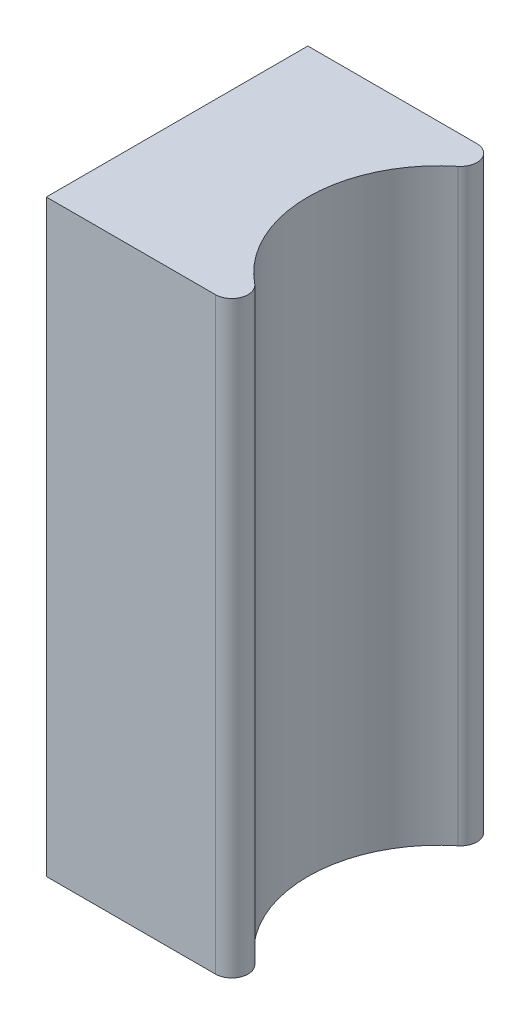
ISO-10303-21;
HEADER;
FILE_DESCRIPTION(('STEP AP214'),'2;1');
FILE_NAME('part.step','',(''),(''),'','','');
FILE_SCHEMA(('AUTOMOTIVE_DESIGN { 1 0 10303 214 1 1 1 1 }'));
ENDSEC;
DATA;
#1=APPLICATION_CONTEXT('core data for automotive mechanical design processes');
#2=APPLICATION_PROTOCOL_DEFINITION('international standard','automotive_design',2000,#1);
#3=PRODUCT_CONTEXT('',#1,'mechanical');
#4=PRODUCT('Part','Part','',(#3));
#5=PRODUCT_RELATED_PRODUCT_CATEGORY('part','',(#4));
#6=PRODUCT_DEFINITION_FORMATION('','',#4);
#7=PRODUCT_DEFINITION_CONTEXT('part definition',#1,'design');
#8=PRODUCT_DEFINITION('design','',#6,#7);
#9=PRODUCT_DEFINITION_SHAPE('','',#8);
#10=(LENGTH_UNIT() NAMED_UNIT(*) SI_UNIT(.MILLI.,.METRE.));
#11=(NAMED_UNIT(*) PLANE_ANGLE_UNIT() SI_UNIT($,.RADIAN.));
#12=(NAMED_UNIT(*) SI_UNIT($,.STERADIAN.) SOLID_ANGLE_UNIT());
#13=UNCERTAINTY_MEASURE_WITH_UNIT(LENGTH_MEASURE(1.E-05),#10,'distance_accuracy_value','');
#14=(GEOMETRIC_REPRESENTATION_CONTEXT(3) GLOBAL_UNCERTAINTY_ASSIGNED_CONTEXT((#13)) GLOBAL_UNIT_ASSIGNED_CONTEXT((#10,
#11,#12)) REPRESENTATION_CONTEXT('',''));
#15=CARTESIAN_POINT('',(0.,0.,0.));
#16=DIRECTION('',(0.,0.,1.));
#17=DIRECTION('',(1.,0.,0.));
#18=AXIS2_PLACEMENT_3D('',#15,#16,#17);
#19=CARTESIAN_POINT('',(-2.38125,57.15,-12.7));
#20=DIRECTION('',(0.,-1.,0.));
#21=DIRECTION('',(0.,0.,-1.));
#22=AXIS2_PLACEMENT_3D('',#19,#20,#21);
#23=CYLINDRICAL_SURFACE('',#22,12.7);
#24=CARTESIAN_POINT('',(-2.38125,0.,-12.7));
#25=DIRECTION('',(0.,1.,0.));
#26=DIRECTION('',(0.,0.,1.));
#27=AXIS2_PLACEMENT_3D('',#24,#25,#26);
#28=CIRCLE('',#27,12.7);
#29=CARTESIAN_POINT('',(-10.3636998853948,0.,-22.5777777777778));
#30=VERTEX_POINT('',#29);
#31=CARTESIAN_POINT('',(-10.3636998853948,0.,-2.82222222222222));
#32=VERTEX_POINT('',#31);
#33=EDGE_CURVE('E117',#30,#32,#28,.T.);
#34=ORIENTED_EDGE('',*,*,#33,.F.);
#35=DIRECTION('',(0.,-1.,0.));
#36=VECTOR('',#35,1.);
#37=CARTESIAN_POINT('',(-10.3636998853948,57.15,-22.5777777777778));
#38=LINE('',#37,#36);
#39=CARTESIAN_POINT('',(-10.3636998853948,57.15,-22.5777777777778));
#40=VERTEX_POINT('',#39);
#41=EDGE_CURVE('E11',#40,#30,#38,.T.);
#42=ORIENTED_EDGE('',*,*,#41,.F.);
#43=CARTESIAN_POINT('',(-2.38125,57.15,-12.7));
#44=DIRECTION('',(0.,1.,0.));
#45=DIRECTION('',(0.,0.,1.));
#46=AXIS2_PLACEMENT_3D('',#43,#44,#45);
#47=CIRCLE('',#46,12.7);
#48=CARTESIAN_POINT('',(-10.3636998853948,57.15,-2.82222222222222));
#49=VERTEX_POINT('',#48);
#50=EDGE_CURVE('E130',#40,#49,#47,.T.);
#51=ORIENTED_EDGE('',*,*,#50,.T.);
#52=DIRECTION('',(0.,-1.,0.));
#53=VECTOR('',#52,1.);
#54=CARTESIAN_POINT('',(-10.3636998853948,57.15,-2.82222222222222));
#55=LINE('',#54,#53);
#56=EDGE_CURVE('E79',#49,#32,#55,.T.);
#57=ORIENTED_EDGE('',*,*,#56,.T.);
#58=EDGE_LOOP('',(#34,#42,#51,#57));
#59=FACE_BOUND('',#58,.T.);
#60=ADVANCED_FACE('F35',(#59),#23,.F.);
#61=CARTESIAN_POINT('',(-11.3615061210692,57.15,-23.8125));
#62=DIRECTION('',(0.,-1.,0.));
#63=DIRECTION('',(0.,0.,-1.));
#64=AXIS2_PLACEMENT_3D('',#61,#62,#63);
#65=CYLINDRICAL_SURFACE('',#64,1.5875);
#66=CARTESIAN_POINT('',(-11.3615061210692,0.,-23.8125));
#67=DIRECTION('',(0.,1.,0.));
#68=DIRECTION('',(0.,0.,1.));
#69=AXIS2_PLACEMENT_3D('',#66,#67,#68);
#70=CIRCLE('',#69,1.5875);
#71=CARTESIAN_POINT('',(-11.3615061210692,0.,-25.4));
#72=VERTEX_POINT('',#71);
#73=EDGE_CURVE('E120',#72,#30,#70,.F.);
#74=ORIENTED_EDGE('',*,*,#73,.F.);
#75=DIRECTION('',(0.,-1.,0.));
#76=VECTOR('',#75,1.);
#77=CARTESIAN_POINT('',(-11.3615061210692,57.15,-25.4));
#78=LINE('',#77,#76);
#79=CARTESIAN_POINT('',(-11.3615061210692,57.15,-25.4));
#80=VERTEX_POINT('',#79);
#81=EDGE_CURVE('E43',#80,#72,#78,.T.);
#82=ORIENTED_EDGE('',*,*,#81,.F.);
#83=CARTESIAN_POINT('',(-11.3615061210692,57.15,-23.8125));
#84=DIRECTION('',(0.,1.,0.));
#85=DIRECTION('',(0.,0.,1.));
#86=AXIS2_PLACEMENT_3D('',#83,#84,#85);
#87=CIRCLE('',#86,1.5875);
#88=EDGE_CURVE('E112',#80,#40,#87,.F.);
#89=ORIENTED_EDGE('',*,*,#88,.T.);
#90=ORIENTED_EDGE('',*,*,#41,.T.);
#91=EDGE_LOOP('',(#74,#82,#89,#90));
#92=FACE_BOUND('',#91,.T.);
#93=ADVANCED_FACE('F139',(#92),#65,.T.);
#94=CARTESIAN_POINT('',(0.,57.15,-25.4));
#95=DIRECTION('',(0.,0.,-1.));
#96=DIRECTION('',(-1.,0.,0.));
#97=AXIS2_PLACEMENT_3D('',#94,#95,#96);
#98=PLANE('',#97);
#99=DIRECTION('',(1.,0.,0.));
#100=VECTOR('',#99,1.);
#101=CARTESIAN_POINT('',(0.,0.,-25.4));
#102=LINE('',#101,#100);
#103=CARTESIAN_POINT('',(-27.78125,0.,-25.4));
#104=VERTEX_POINT('',#103);
#105=EDGE_CURVE('E123',#104,#72,#102,.T.);
#106=ORIENTED_EDGE('',*,*,#105,.F.);
#107=DIRECTION('',(0.,-1.,0.));
#108=VECTOR('',#107,1.);
#109=CARTESIAN_POINT('',(-27.78125,57.15,-25.4));
#110=LINE('',#109,#108);
#111=CARTESIAN_POINT('',(-27.78125,57.15,-25.4));
#112=VERTEX_POINT('',#111);
#113=EDGE_CURVE('E100',#112,#104,#110,.T.);
#114=ORIENTED_EDGE('',*,*,#113,.F.);
#115=DIRECTION('',(1.,0.,0.));
#116=VECTOR('',#115,1.);
#117=CARTESIAN_POINT('',(0.,57.15,-25.4));
#118=LINE('',#117,#116);
#119=EDGE_CURVE('E110',#112,#80,#118,.T.);
#120=ORIENTED_EDGE('',*,*,#119,.T.);
#121=ORIENTED_EDGE('',*,*,#81,.T.);
#122=EDGE_LOOP('',(#106,#114,#120,#121));
#123=FACE_BOUND('',#122,.T.);
#124=ADVANCED_FACE('F136',(#123),#98,.T.);
#125=CARTESIAN_POINT('',(-27.78125,57.15,0.));
#126=DIRECTION('',(-1.,0.,0.));
#127=DIRECTION('',(0.,0.,1.));
#128=AXIS2_PLACEMENT_3D('',#125,#126,#127);
#129=PLANE('',#128);
#130=DIRECTION('',(0.,0.,-1.));
#131=VECTOR('',#130,1.);
#132=CARTESIAN_POINT('',(-27.78125,0.,0.));
#133=LINE('',#132,#131);
#134=CARTESIAN_POINT('',(-27.78125,0.,0.));
#135=VERTEX_POINT('',#134);
#136=EDGE_CURVE('E99',#135,#104,#133,.T.);
#137=ORIENTED_EDGE('',*,*,#136,.F.);
#138=DIRECTION('',(0.,-1.,0.));
#139=VECTOR('',#138,1.);
#140=CARTESIAN_POINT('',(-27.78125,57.15,0.));
#141=LINE('',#140,#139);
#142=CARTESIAN_POINT('',(-27.78125,57.15,0.));
#143=VERTEX_POINT('',#142);
#144=EDGE_CURVE('E93',#143,#135,#141,.T.);
#145=ORIENTED_EDGE('',*,*,#144,.F.);
#146=DIRECTION('',(0.,0.,-1.));
#147=VECTOR('',#146,1.);
#148=CARTESIAN_POINT('',(-27.78125,57.15,0.));
#149=LINE('',#148,#147);
#150=EDGE_CURVE('E97',#143,#112,#149,.T.);
#151=ORIENTED_EDGE('',*,*,#150,.T.);
#152=ORIENTED_EDGE('',*,*,#113,.T.);
#153=EDGE_LOOP('',(#137,#145,#151,#152));
#154=FACE_BOUND('',#153,.T.);
#155=ADVANCED_FACE('F95',(#154),#129,.T.);
#156=CARTESIAN_POINT('',(0.,57.15,0.));
#157=DIRECTION('',(0.,0.,-1.));
#158=DIRECTION('',(-1.,0.,0.));
#159=AXIS2_PLACEMENT_3D('',#156,#157,#158);
#160=PLANE('',#159);
#161=DIRECTION('',(1.,0.,0.));
#162=VECTOR('',#161,1.);
#163=CARTESIAN_POINT('',(0.,0.,0.));
#164=LINE('',#163,#162);
#165=CARTESIAN_POINT('',(-11.3615061210692,0.,0.));
#166=VERTEX_POINT('',#165);
#167=EDGE_CURVE('E72',#135,#166,#164,.T.);
#168=ORIENTED_EDGE('',*,*,#167,.T.);
#169=DIRECTION('',(0.,-1.,0.));
#170=VECTOR('',#169,1.);
#171=CARTESIAN_POINT('',(-11.3615061210692,57.15,0.));
#172=LINE('',#171,#170);
#173=CARTESIAN_POINT('',(-11.3615061210692,57.15,0.));
#174=VERTEX_POINT('',#173);
#175=EDGE_CURVE('E101',#174,#166,#172,.T.);
#176=ORIENTED_EDGE('',*,*,#175,.F.);
#177=DIRECTION('',(1.,0.,0.));
#178=VECTOR('',#177,1.);
#179=CARTESIAN_POINT('',(0.,57.15,0.));
#180=LINE('',#179,#178);
#181=EDGE_CURVE('E103',#143,#174,#180,.T.);
#182=ORIENTED_EDGE('',*,*,#181,.F.);
#183=ORIENTED_EDGE('',*,*,#144,.T.);
#184=EDGE_LOOP('',(#168,#176,#182,#183));
#185=FACE_BOUND('',#184,.T.);
#186=ADVANCED_FACE('F104',(#185),#160,.F.);
#187=CARTESIAN_POINT('',(-11.3615061210692,57.15,-1.5875));
#188=DIRECTION('',(0.,-1.,0.));
#189=DIRECTION('',(0.,0.,-1.));
#190=AXIS2_PLACEMENT_3D('',#187,#188,#189);
#191=CYLINDRICAL_SURFACE('',#190,1.5875);
#192=CARTESIAN_POINT('',(-11.3615061210692,0.,-1.5875));
#193=DIRECTION('',(0.,1.,0.));
#194=DIRECTION('',(0.,0.,1.));
#195=AXIS2_PLACEMENT_3D('',#192,#193,#194);
#196=CIRCLE('',#195,1.5875);
#197=EDGE_CURVE('E128',#166,#32,#196,.T.);
#198=ORIENTED_EDGE('',*,*,#197,.T.);
#199=ORIENTED_EDGE('',*,*,#56,.F.);
#200=CARTESIAN_POINT('',(-11.3615061210692,57.15,-1.5875));
#201=DIRECTION('',(0.,1.,0.));
#202=DIRECTION('',(0.,0.,1.));
#203=AXIS2_PLACEMENT_3D('',#200,#201,#202);
#204=CIRCLE('',#203,1.5875);
#205=EDGE_CURVE('E51',#174,#49,#204,.T.);
#206=ORIENTED_EDGE('',*,*,#205,.F.);
#207=ORIENTED_EDGE('',*,*,#175,.T.);
#208=EDGE_LOOP('',(#198,#199,#206,#207));
#209=FACE_BOUND('',#208,.T.);
#210=ADVANCED_FACE('F144',(#209),#191,.T.);
#211=CARTESIAN_POINT('',(0.,57.15,0.));
#212=DIRECTION('',(0.,1.,0.));
#213=DIRECTION('',(0.,0.,1.));
#214=AXIS2_PLACEMENT_3D('',#211,#212,#213);
#215=PLANE('',#214);
#216=ORIENTED_EDGE('',*,*,#50,.F.);
#217=ORIENTED_EDGE('',*,*,#88,.F.);
#218=ORIENTED_EDGE('',*,*,#119,.F.);
#219=ORIENTED_EDGE('',*,*,#150,.F.);
#220=ORIENTED_EDGE('',*,*,#181,.T.);
#221=ORIENTED_EDGE('',*,*,#205,.T.);
#222=EDGE_LOOP('',(#216,#217,#218,#219,#220,#221));
#223=FACE_BOUND('',#222,.T.);
#224=ADVANCED_FACE('F107',(#223),#215,.T.);
#225=CARTESIAN_POINT('',(0.,0.,0.));
#226=DIRECTION('',(0.,1.,0.));
#227=DIRECTION('',(0.,0.,1.));
#228=AXIS2_PLACEMENT_3D('',#225,#226,#227);
#229=PLANE('',#228);
#230=ORIENTED_EDGE('',*,*,#33,.T.);
#231=ORIENTED_EDGE('',*,*,#197,.F.);
#232=ORIENTED_EDGE('',*,*,#167,.F.);
#233=ORIENTED_EDGE('',*,*,#136,.T.);
#234=ORIENTED_EDGE('',*,*,#105,.T.);
#235=ORIENTED_EDGE('',*,*,#73,.T.);
#236=EDGE_LOOP('',(#230,#231,#232,#233,#234,#235));
#237=FACE_BOUND('',#236,.T.);
#238=ADVANCED_FACE('F141',(#237),#229,.F.);
#239=CLOSED_SHELL('',(#60,#93,#124,#155,#186,#210,#224,#238));
#240=MANIFOLD_SOLID_BREP('B2',#239);
#241=ADVANCED_BREP_SHAPE_REPRESENTATION('',(#18,#240),#14);
#242=SHAPE_DEFINITION_REPRESENTATION(#9,#241);
ENDSEC;
END-ISO-10303-21;
